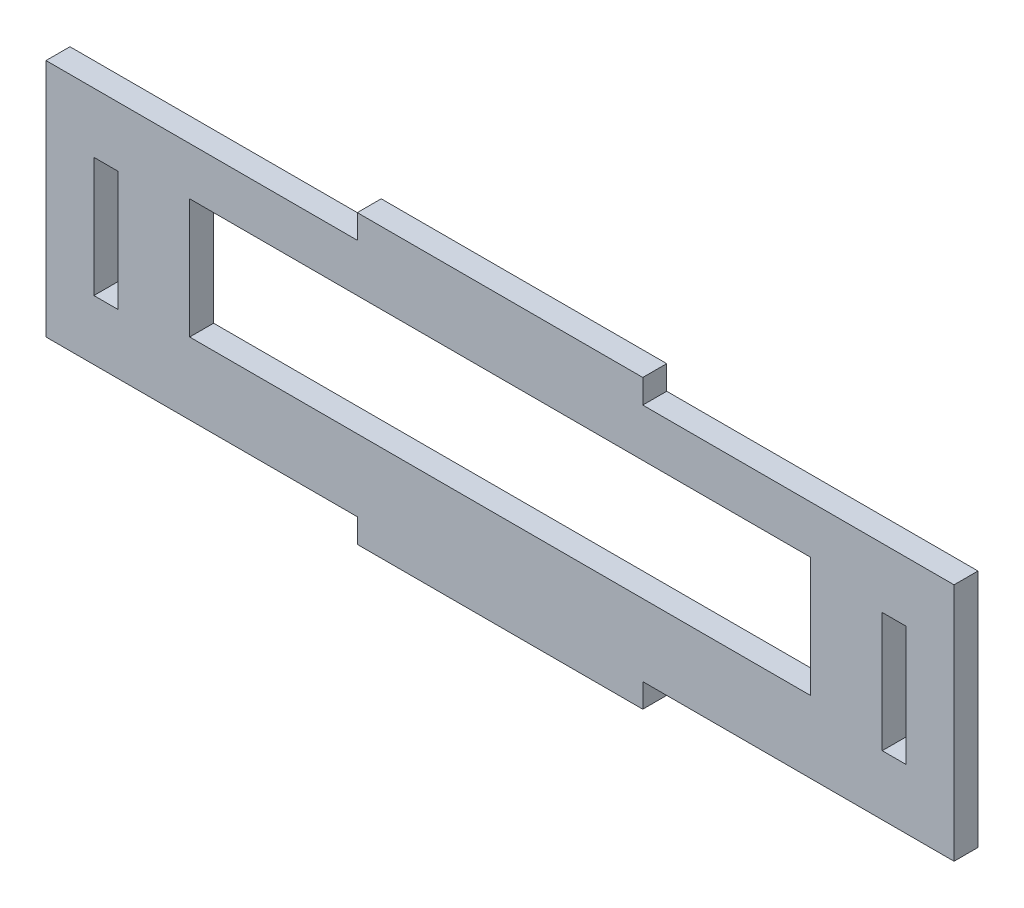
ISO-10303-21;
HEADER;
FILE_DESCRIPTION(('STEP AP214'),'2;1');
FILE_NAME('part.step','',(''),(''),'','','');
FILE_SCHEMA(('AUTOMOTIVE_DESIGN { 1 0 10303 214 1 1 1 1 }'));
ENDSEC;
DATA;
#1=APPLICATION_CONTEXT('core data for automotive mechanical design processes');
#2=APPLICATION_PROTOCOL_DEFINITION('international standard','automotive_design',2000,#1);
#3=PRODUCT_CONTEXT('',#1,'mechanical');
#4=PRODUCT('Part','Part','',(#3));
#5=PRODUCT_RELATED_PRODUCT_CATEGORY('part','',(#4));
#6=PRODUCT_DEFINITION_FORMATION('','',#4);
#7=PRODUCT_DEFINITION_CONTEXT('part definition',#1,'design');
#8=PRODUCT_DEFINITION('design','',#6,#7);
#9=PRODUCT_DEFINITION_SHAPE('','',#8);
#10=(LENGTH_UNIT() NAMED_UNIT(*) SI_UNIT(.MILLI.,.METRE.));
#11=(NAMED_UNIT(*) PLANE_ANGLE_UNIT() SI_UNIT($,.RADIAN.));
#12=(NAMED_UNIT(*) SI_UNIT($,.STERADIAN.) SOLID_ANGLE_UNIT());
#13=UNCERTAINTY_MEASURE_WITH_UNIT(LENGTH_MEASURE(1.E-05),#10,'distance_accuracy_value','');
#14=(GEOMETRIC_REPRESENTATION_CONTEXT(3) GLOBAL_UNCERTAINTY_ASSIGNED_CONTEXT((#13)) GLOBAL_UNIT_ASSIGNED_CONTEXT((#10,
#11,#12)) REPRESENTATION_CONTEXT('',''));
#15=CARTESIAN_POINT('',(0.,0.,0.));
#16=DIRECTION('',(0.,0.,1.));
#17=DIRECTION('',(1.,0.,0.));
#18=AXIS2_PLACEMENT_3D('',#15,#16,#17);
#19=CARTESIAN_POINT('',(0.,0.,2.));
#20=DIRECTION('',(0.,0.,-1.));
#21=DIRECTION('',(-1.,0.,0.));
#22=AXIS2_PLACEMENT_3D('',#19,#20,#21);
#23=PLANE('',#22);
#24=DIRECTION('',(0.,-1.,0.));
#25=VECTOR('',#24,1.);
#26=CARTESIAN_POINT('',(2.,15.,2.));
#27=LINE('',#26,#25);
#28=CARTESIAN_POINT('',(2.,15.,2.));
#29=VERTEX_POINT('',#28);
#30=CARTESIAN_POINT('',(2.,5.,2.));
#31=VERTEX_POINT('',#30);
#32=EDGE_CURVE('E249',#29,#31,#27,.T.);
#33=ORIENTED_EDGE('',*,*,#32,.F.);
#34=DIRECTION('',(-1.,0.,0.));
#35=VECTOR('',#34,1.);
#36=CARTESIAN_POINT('',(2.,15.,2.));
#37=LINE('',#36,#35);
#38=CARTESIAN_POINT('',(3.99999999999999,15.,2.));
#39=VERTEX_POINT('',#38);
#40=EDGE_CURVE('E260',#39,#29,#37,.T.);
#41=ORIENTED_EDGE('',*,*,#40,.F.);
#42=DIRECTION('',(0.,1.,0.));
#43=VECTOR('',#42,1.);
#44=CARTESIAN_POINT('',(3.99999999999999,15.,2.));
#45=LINE('',#44,#43);
#46=CARTESIAN_POINT('',(3.99999999999999,5.,2.));
#47=VERTEX_POINT('',#46);
#48=EDGE_CURVE('E256',#47,#39,#45,.T.);
#49=ORIENTED_EDGE('',*,*,#48,.F.);
#50=DIRECTION('',(1.,0.,0.));
#51=VECTOR('',#50,1.);
#52=CARTESIAN_POINT('',(2.,5.,2.));
#53=LINE('',#52,#51);
#54=EDGE_CURVE('E252',#31,#47,#53,.T.);
#55=ORIENTED_EDGE('',*,*,#54,.F.);
#56=EDGE_LOOP('',(#33,#41,#49,#55));
#57=FACE_BOUND('',#56,.T.);
#58=DIRECTION('',(1.,0.,0.));
#59=VECTOR('',#58,1.);
#60=CARTESIAN_POINT('',(-2.,0.,2.));
#61=LINE('',#60,#59);
#62=CARTESIAN_POINT('',(-2.,0.,2.));
#63=VERTEX_POINT('',#62);
#64=CARTESIAN_POINT('',(24.,0.,2.));
#65=VERTEX_POINT('',#64);
#66=EDGE_CURVE('E335',#63,#65,#61,.T.);
#67=ORIENTED_EDGE('',*,*,#66,.T.);
#68=DIRECTION('',(0.,-1.,0.));
#69=VECTOR('',#68,1.);
#70=CARTESIAN_POINT('',(24.,0.,2.));
#71=LINE('',#70,#69);
#72=CARTESIAN_POINT('',(24.,-2.,2.));
#73=VERTEX_POINT('',#72);
#74=EDGE_CURVE('E338',#65,#73,#71,.T.);
#75=ORIENTED_EDGE('',*,*,#74,.T.);
#76=DIRECTION('',(1.,0.,0.));
#77=VECTOR('',#76,1.);
#78=CARTESIAN_POINT('',(24.,-2.,2.));
#79=LINE('',#78,#77);
#80=CARTESIAN_POINT('',(47.848,-2.,2.));
#81=VERTEX_POINT('',#80);
#82=EDGE_CURVE('E342',#73,#81,#79,.T.);
#83=ORIENTED_EDGE('',*,*,#82,.T.);
#84=DIRECTION('',(0.,1.,0.));
#85=VECTOR('',#84,1.);
#86=CARTESIAN_POINT('',(47.848,-2.,2.));
#87=LINE('',#86,#85);
#88=CARTESIAN_POINT('',(47.848,0.,2.));
#89=VERTEX_POINT('',#88);
#90=EDGE_CURVE('E345',#81,#89,#87,.T.);
#91=ORIENTED_EDGE('',*,*,#90,.T.);
#92=DIRECTION('',(1.,0.,0.));
#93=VECTOR('',#92,1.);
#94=CARTESIAN_POINT('',(47.848,0.,2.));
#95=LINE('',#94,#93);
#96=CARTESIAN_POINT('',(73.848,0.,2.));
#97=VERTEX_POINT('',#96);
#98=EDGE_CURVE('E348',#89,#97,#95,.T.);
#99=ORIENTED_EDGE('',*,*,#98,.T.);
#100=DIRECTION('',(0.,1.,0.));
#101=VECTOR('',#100,1.);
#102=CARTESIAN_POINT('',(73.848,20.,2.));
#103=LINE('',#102,#101);
#104=CARTESIAN_POINT('',(73.848,20.,2.));
#105=VERTEX_POINT('',#104);
#106=EDGE_CURVE('E351',#97,#105,#103,.T.);
#107=ORIENTED_EDGE('',*,*,#106,.T.);
#108=DIRECTION('',(-1.,0.,0.));
#109=VECTOR('',#108,1.);
#110=CARTESIAN_POINT('',(71.848,20.,2.));
#111=LINE('',#110,#109);
#112=CARTESIAN_POINT('',(47.848,20.,2.));
#113=VERTEX_POINT('',#112);
#114=EDGE_CURVE('E354',#105,#113,#111,.T.);
#115=ORIENTED_EDGE('',*,*,#114,.T.);
#116=DIRECTION('',(0.,1.,0.));
#117=VECTOR('',#116,1.);
#118=CARTESIAN_POINT('',(47.848,22.,2.));
#119=LINE('',#118,#117);
#120=CARTESIAN_POINT('',(47.848,22.,2.));
#121=VERTEX_POINT('',#120);
#122=EDGE_CURVE('E357',#113,#121,#119,.T.);
#123=ORIENTED_EDGE('',*,*,#122,.T.);
#124=DIRECTION('',(-1.,0.,0.));
#125=VECTOR('',#124,1.);
#126=CARTESIAN_POINT('',(24.,22.,2.));
#127=LINE('',#126,#125);
#128=CARTESIAN_POINT('',(24.,22.,2.));
#129=VERTEX_POINT('',#128);
#130=EDGE_CURVE('E360',#121,#129,#127,.T.);
#131=ORIENTED_EDGE('',*,*,#130,.T.);
#132=DIRECTION('',(0.,-1.,0.));
#133=VECTOR('',#132,1.);
#134=CARTESIAN_POINT('',(24.,20.,2.));
#135=LINE('',#134,#133);
#136=CARTESIAN_POINT('',(24.,20.,2.));
#137=VERTEX_POINT('',#136);
#138=EDGE_CURVE('E363',#129,#137,#135,.T.);
#139=ORIENTED_EDGE('',*,*,#138,.T.);
#140=DIRECTION('',(-1.,0.,0.));
#141=VECTOR('',#140,1.);
#142=CARTESIAN_POINT('',(0.,20.,2.));
#143=LINE('',#142,#141);
#144=CARTESIAN_POINT('',(-2.,20.,2.));
#145=VERTEX_POINT('',#144);
#146=EDGE_CURVE('E366',#137,#145,#143,.T.);
#147=ORIENTED_EDGE('',*,*,#146,.T.);
#148=DIRECTION('',(0.,-1.,0.));
#149=VECTOR('',#148,1.);
#150=CARTESIAN_POINT('',(-2.,20.,2.));
#151=LINE('',#150,#149);
#152=EDGE_CURVE('E369',#145,#63,#151,.T.);
#153=ORIENTED_EDGE('',*,*,#152,.T.);
#154=EDGE_LOOP('',(#67,#75,#83,#91,#99,#107,#115,#123,#131,#139,#147,#153));
#155=FACE_BOUND('',#154,.T.);
#156=DIRECTION('',(0.,-1.,0.));
#157=VECTOR('',#156,1.);
#158=CARTESIAN_POINT('',(10.,6.,2.));
#159=LINE('',#158,#157);
#160=CARTESIAN_POINT('',(10.,16.,2.));
#161=VERTEX_POINT('',#160);
#162=CARTESIAN_POINT('',(10.,6.,2.));
#163=VERTEX_POINT('',#162);
#164=EDGE_CURVE('E292',#161,#163,#159,.T.);
#165=ORIENTED_EDGE('',*,*,#164,.F.);
#166=DIRECTION('',(-1.,0.,0.));
#167=VECTOR('',#166,1.);
#168=CARTESIAN_POINT('',(10.,16.,2.));
#169=LINE('',#168,#167);
#170=CARTESIAN_POINT('',(61.848,16.,2.));
#171=VERTEX_POINT('',#170);
#172=EDGE_CURVE('E303',#171,#161,#169,.T.);
#173=ORIENTED_EDGE('',*,*,#172,.F.);
#174=DIRECTION('',(0.,1.,0.));
#175=VECTOR('',#174,1.);
#176=CARTESIAN_POINT('',(61.848,6.,2.));
#177=LINE('',#176,#175);
#178=CARTESIAN_POINT('',(61.848,6.,2.));
#179=VERTEX_POINT('',#178);
#180=EDGE_CURVE('E299',#179,#171,#177,.T.);
#181=ORIENTED_EDGE('',*,*,#180,.F.);
#182=DIRECTION('',(1.,0.,0.));
#183=VECTOR('',#182,1.);
#184=CARTESIAN_POINT('',(10.,6.,2.));
#185=LINE('',#184,#183);
#186=EDGE_CURVE('E295',#163,#179,#185,.T.);
#187=ORIENTED_EDGE('',*,*,#186,.F.);
#188=EDGE_LOOP('',(#165,#173,#181,#187));
#189=FACE_BOUND('',#188,.T.);
#190=DIRECTION('',(0.,-1.,0.));
#191=VECTOR('',#190,1.);
#192=CARTESIAN_POINT('',(67.848,15.,2.));
#193=LINE('',#192,#191);
#194=CARTESIAN_POINT('',(67.848,15.,2.));
#195=VERTEX_POINT('',#194);
#196=CARTESIAN_POINT('',(67.848,5.,2.));
#197=VERTEX_POINT('',#196);
#198=EDGE_CURVE('E201',#195,#197,#193,.T.);
#199=ORIENTED_EDGE('',*,*,#198,.F.);
#200=DIRECTION('',(-1.,0.,0.));
#201=VECTOR('',#200,1.);
#202=CARTESIAN_POINT('',(67.848,15.,2.));
#203=LINE('',#202,#201);
#204=CARTESIAN_POINT('',(69.848,15.,2.));
#205=VERTEX_POINT('',#204);
#206=EDGE_CURVE('E227',#205,#195,#203,.T.);
#207=ORIENTED_EDGE('',*,*,#206,.F.);
#208=DIRECTION('',(0.,1.,0.));
#209=VECTOR('',#208,1.);
#210=CARTESIAN_POINT('',(69.848,15.,2.));
#211=LINE('',#210,#209);
#212=CARTESIAN_POINT('',(69.848,5.,2.));
#213=VERTEX_POINT('',#212);
#214=EDGE_CURVE('E223',#213,#205,#211,.T.);
#215=ORIENTED_EDGE('',*,*,#214,.F.);
#216=DIRECTION('',(1.,0.,0.));
#217=VECTOR('',#216,1.);
#218=CARTESIAN_POINT('',(67.848,5.,2.));
#219=LINE('',#218,#217);
#220=EDGE_CURVE('E210',#197,#213,#219,.T.);
#221=ORIENTED_EDGE('',*,*,#220,.F.);
#222=EDGE_LOOP('',(#199,#207,#215,#221));
#223=FACE_BOUND('',#222,.T.);
#224=ADVANCED_FACE('F39',(#57,#155,#189,#223),#23,.F.);
#225=CARTESIAN_POINT('',(0.,0.,0.));
#226=DIRECTION('',(0.,0.,-1.));
#227=DIRECTION('',(-1.,0.,0.));
#228=AXIS2_PLACEMENT_3D('',#225,#226,#227);
#229=PLANE('',#228);
#230=DIRECTION('',(1.,0.,0.));
#231=VECTOR('',#230,1.);
#232=CARTESIAN_POINT('',(0.,0.,0.));
#233=LINE('',#232,#231);
#234=CARTESIAN_POINT('',(-2.,0.,0.));
#235=VERTEX_POINT('',#234);
#236=CARTESIAN_POINT('',(24.,0.,0.));
#237=VERTEX_POINT('',#236);
#238=EDGE_CURVE('E334',#235,#237,#233,.T.);
#239=ORIENTED_EDGE('',*,*,#238,.F.);
#240=DIRECTION('',(0.,-1.,0.));
#241=VECTOR('',#240,1.);
#242=CARTESIAN_POINT('',(-2.,20.,0.));
#243=LINE('',#242,#241);
#244=CARTESIAN_POINT('',(-2.,20.,0.));
#245=VERTEX_POINT('',#244);
#246=EDGE_CURVE('E339',#245,#235,#243,.T.);
#247=ORIENTED_EDGE('',*,*,#246,.F.);
#248=DIRECTION('',(-1.,0.,0.));
#249=VECTOR('',#248,1.);
#250=CARTESIAN_POINT('',(0.,20.,0.));
#251=LINE('',#250,#249);
#252=CARTESIAN_POINT('',(24.,20.,0.));
#253=VERTEX_POINT('',#252);
#254=EDGE_CURVE('E405',#253,#245,#251,.T.);
#255=ORIENTED_EDGE('',*,*,#254,.F.);
#256=DIRECTION('',(0.,-1.,0.));
#257=VECTOR('',#256,1.);
#258=CARTESIAN_POINT('',(24.,20.,0.));
#259=LINE('',#258,#257);
#260=CARTESIAN_POINT('',(24.,22.,0.));
#261=VERTEX_POINT('',#260);
#262=EDGE_CURVE('E401',#261,#253,#259,.T.);
#263=ORIENTED_EDGE('',*,*,#262,.F.);
#264=DIRECTION('',(-1.,0.,0.));
#265=VECTOR('',#264,1.);
#266=CARTESIAN_POINT('',(24.,22.,0.));
#267=LINE('',#266,#265);
#268=CARTESIAN_POINT('',(47.848,22.,0.));
#269=VERTEX_POINT('',#268);
#270=EDGE_CURVE('E398',#269,#261,#267,.T.);
#271=ORIENTED_EDGE('',*,*,#270,.F.);
#272=DIRECTION('',(0.,1.,0.));
#273=VECTOR('',#272,1.);
#274=CARTESIAN_POINT('',(47.848,22.,0.));
#275=LINE('',#274,#273);
#276=CARTESIAN_POINT('',(47.848,20.,0.));
#277=VERTEX_POINT('',#276);
#278=EDGE_CURVE('E395',#277,#269,#275,.T.);
#279=ORIENTED_EDGE('',*,*,#278,.F.);
#280=DIRECTION('',(-1.,0.,0.));
#281=VECTOR('',#280,1.);
#282=CARTESIAN_POINT('',(47.848,20.,0.));
#283=LINE('',#282,#281);
#284=CARTESIAN_POINT('',(73.848,20.,0.));
#285=VERTEX_POINT('',#284);
#286=EDGE_CURVE('E392',#285,#277,#283,.T.);
#287=ORIENTED_EDGE('',*,*,#286,.F.);
#288=DIRECTION('',(0.,1.,0.));
#289=VECTOR('',#288,1.);
#290=CARTESIAN_POINT('',(73.848,20.,0.));
#291=LINE('',#290,#289);
#292=CARTESIAN_POINT('',(73.848,0.,0.));
#293=VERTEX_POINT('',#292);
#294=EDGE_CURVE('E388',#293,#285,#291,.T.);
#295=ORIENTED_EDGE('',*,*,#294,.F.);
#296=DIRECTION('',(1.,0.,0.));
#297=VECTOR('',#296,1.);
#298=CARTESIAN_POINT('',(73.848,0.,0.));
#299=LINE('',#298,#297);
#300=CARTESIAN_POINT('',(47.848,0.,0.));
#301=VERTEX_POINT('',#300);
#302=EDGE_CURVE('E385',#301,#293,#299,.T.);
#303=ORIENTED_EDGE('',*,*,#302,.F.);
#304=DIRECTION('',(0.,1.,0.));
#305=VECTOR('',#304,1.);
#306=CARTESIAN_POINT('',(47.848,-2.,0.));
#307=LINE('',#306,#305);
#308=CARTESIAN_POINT('',(47.848,-2.,0.));
#309=VERTEX_POINT('',#308);
#310=EDGE_CURVE('E381',#309,#301,#307,.T.);
#311=ORIENTED_EDGE('',*,*,#310,.F.);
#312=DIRECTION('',(1.,0.,0.));
#313=VECTOR('',#312,1.);
#314=CARTESIAN_POINT('',(24.,-2.,0.));
#315=LINE('',#314,#313);
#316=CARTESIAN_POINT('',(24.,-2.,0.));
#317=VERTEX_POINT('',#316);
#318=EDGE_CURVE('E378',#317,#309,#315,.T.);
#319=ORIENTED_EDGE('',*,*,#318,.F.);
#320=DIRECTION('',(0.,-1.,0.));
#321=VECTOR('',#320,1.);
#322=CARTESIAN_POINT('',(24.,0.,0.));
#323=LINE('',#322,#321);
#324=EDGE_CURVE('E375',#237,#317,#323,.T.);
#325=ORIENTED_EDGE('',*,*,#324,.F.);
#326=EDGE_LOOP('',(#239,#247,#255,#263,#271,#279,#287,#295,#303,#311,#319,#325));
#327=FACE_BOUND('',#326,.T.);
#328=DIRECTION('',(-1.,0.,0.));
#329=VECTOR('',#328,1.);
#330=CARTESIAN_POINT('',(10.,16.,0.));
#331=LINE('',#330,#329);
#332=CARTESIAN_POINT('',(61.848,16.,0.));
#333=VERTEX_POINT('',#332);
#334=CARTESIAN_POINT('',(10.,16.,0.));
#335=VERTEX_POINT('',#334);
#336=EDGE_CURVE('E296',#333,#335,#331,.T.);
#337=ORIENTED_EDGE('',*,*,#336,.T.);
#338=DIRECTION('',(0.,-1.,0.));
#339=VECTOR('',#338,1.);
#340=CARTESIAN_POINT('',(10.,6.,0.));
#341=LINE('',#340,#339);
#342=CARTESIAN_POINT('',(10.,6.,0.));
#343=VERTEX_POINT('',#342);
#344=EDGE_CURVE('E291',#335,#343,#341,.T.);
#345=ORIENTED_EDGE('',*,*,#344,.T.);
#346=DIRECTION('',(1.,0.,0.));
#347=VECTOR('',#346,1.);
#348=CARTESIAN_POINT('',(10.,6.,0.));
#349=LINE('',#348,#347);
#350=CARTESIAN_POINT('',(61.848,6.,0.));
#351=VERTEX_POINT('',#350);
#352=EDGE_CURVE('E310',#343,#351,#349,.T.);
#353=ORIENTED_EDGE('',*,*,#352,.T.);
#354=DIRECTION('',(0.,1.,0.));
#355=VECTOR('',#354,1.);
#356=CARTESIAN_POINT('',(61.848,6.,0.));
#357=LINE('',#356,#355);
#358=EDGE_CURVE('E314',#351,#333,#357,.T.);
#359=ORIENTED_EDGE('',*,*,#358,.T.);
#360=EDGE_LOOP('',(#337,#345,#353,#359));
#361=FACE_BOUND('',#360,.T.);
#362=DIRECTION('',(-1.,0.,0.));
#363=VECTOR('',#362,1.);
#364=CARTESIAN_POINT('',(2.,15.,0.));
#365=LINE('',#364,#363);
#366=CARTESIAN_POINT('',(3.99999999999999,15.,0.));
#367=VERTEX_POINT('',#366);
#368=CARTESIAN_POINT('',(2.,15.,0.));
#369=VERTEX_POINT('',#368);
#370=EDGE_CURVE('E253',#367,#369,#365,.T.);
#371=ORIENTED_EDGE('',*,*,#370,.T.);
#372=DIRECTION('',(0.,-1.,0.));
#373=VECTOR('',#372,1.);
#374=CARTESIAN_POINT('',(2.,15.,0.));
#375=LINE('',#374,#373);
#376=CARTESIAN_POINT('',(2.,5.,0.));
#377=VERTEX_POINT('',#376);
#378=EDGE_CURVE('E219',#369,#377,#375,.T.);
#379=ORIENTED_EDGE('',*,*,#378,.T.);
#380=DIRECTION('',(1.,0.,0.));
#381=VECTOR('',#380,1.);
#382=CARTESIAN_POINT('',(2.,5.,0.));
#383=LINE('',#382,#381);
#384=CARTESIAN_POINT('',(3.99999999999999,5.,0.));
#385=VERTEX_POINT('',#384);
#386=EDGE_CURVE('E267',#377,#385,#383,.T.);
#387=ORIENTED_EDGE('',*,*,#386,.T.);
#388=DIRECTION('',(0.,1.,0.));
#389=VECTOR('',#388,1.);
#390=CARTESIAN_POINT('',(3.99999999999999,15.,0.));
#391=LINE('',#390,#389);
#392=EDGE_CURVE('E271',#385,#367,#391,.T.);
#393=ORIENTED_EDGE('',*,*,#392,.T.);
#394=EDGE_LOOP('',(#371,#379,#387,#393));
#395=FACE_BOUND('',#394,.T.);
#396=DIRECTION('',(-1.,0.,0.));
#397=VECTOR('',#396,1.);
#398=CARTESIAN_POINT('',(67.848,15.,0.));
#399=LINE('',#398,#397);
#400=CARTESIAN_POINT('',(69.848,15.,0.));
#401=VERTEX_POINT('',#400);
#402=CARTESIAN_POINT('',(67.848,15.,0.));
#403=VERTEX_POINT('',#402);
#404=EDGE_CURVE('E211',#401,#403,#399,.T.);
#405=ORIENTED_EDGE('',*,*,#404,.T.);
#406=DIRECTION('',(0.,-1.,0.));
#407=VECTOR('',#406,1.);
#408=CARTESIAN_POINT('',(67.848,15.,0.));
#409=LINE('',#408,#407);
#410=CARTESIAN_POINT('',(67.848,5.,0.));
#411=VERTEX_POINT('',#410);
#412=EDGE_CURVE('E63',#403,#411,#409,.T.);
#413=ORIENTED_EDGE('',*,*,#412,.T.);
#414=DIRECTION('',(1.,0.,0.));
#415=VECTOR('',#414,1.);
#416=CARTESIAN_POINT('',(67.848,5.,0.));
#417=LINE('',#416,#415);
#418=CARTESIAN_POINT('',(69.848,5.,0.));
#419=VERTEX_POINT('',#418);
#420=EDGE_CURVE('E217',#411,#419,#417,.T.);
#421=ORIENTED_EDGE('',*,*,#420,.T.);
#422=DIRECTION('',(0.,1.,0.));
#423=VECTOR('',#422,1.);
#424=CARTESIAN_POINT('',(69.848,15.,0.));
#425=LINE('',#424,#423);
#426=EDGE_CURVE('E236',#419,#401,#425,.T.);
#427=ORIENTED_EDGE('',*,*,#426,.T.);
#428=EDGE_LOOP('',(#405,#413,#421,#427));
#429=FACE_BOUND('',#428,.T.);
#430=ADVANCED_FACE('F462',(#327,#361,#395,#429),#229,.T.);
#431=CARTESIAN_POINT('',(0.,0.,2.));
#432=DIRECTION('',(0.,1.,0.));
#433=DIRECTION('',(0.,0.,1.));
#434=AXIS2_PLACEMENT_3D('',#431,#432,#433);
#435=PLANE('',#434);
#436=ORIENTED_EDGE('',*,*,#238,.T.);
#437=DIRECTION('',(0.,0.,-1.));
#438=VECTOR('',#437,1.);
#439=CARTESIAN_POINT('',(24.,0.,2.));
#440=LINE('',#439,#438);
#441=EDGE_CURVE('E11',#65,#237,#440,.T.);
#442=ORIENTED_EDGE('',*,*,#441,.F.);
#443=ORIENTED_EDGE('',*,*,#66,.F.);
#444=DIRECTION('',(0.,0.,-1.));
#445=VECTOR('',#444,1.);
#446=CARTESIAN_POINT('',(-2.,0.,2.));
#447=LINE('',#446,#445);
#448=EDGE_CURVE('E372',#63,#235,#447,.T.);
#449=ORIENTED_EDGE('',*,*,#448,.T.);
#450=EDGE_LOOP('',(#436,#442,#443,#449));
#451=FACE_BOUND('',#450,.T.);
#452=ADVANCED_FACE('F41',(#451),#435,.F.);
#453=CARTESIAN_POINT('',(24.,0.,2.));
#454=DIRECTION('',(1.,0.,0.));
#455=DIRECTION('',(0.,0.,-1.));
#456=AXIS2_PLACEMENT_3D('',#453,#454,#455);
#457=PLANE('',#456);
#458=ORIENTED_EDGE('',*,*,#324,.T.);
#459=DIRECTION('',(0.,0.,-1.));
#460=VECTOR('',#459,1.);
#461=CARTESIAN_POINT('',(24.,-2.,2.));
#462=LINE('',#461,#460);
#463=EDGE_CURVE('E48',#73,#317,#462,.T.);
#464=ORIENTED_EDGE('',*,*,#463,.F.);
#465=ORIENTED_EDGE('',*,*,#74,.F.);
#466=ORIENTED_EDGE('',*,*,#441,.T.);
#467=EDGE_LOOP('',(#458,#464,#465,#466));
#468=FACE_BOUND('',#467,.T.);
#469=ADVANCED_FACE('F479',(#468),#457,.F.);
#470=CARTESIAN_POINT('',(24.,-2.,2.));
#471=DIRECTION('',(0.,1.,0.));
#472=DIRECTION('',(0.,0.,1.));
#473=AXIS2_PLACEMENT_3D('',#470,#471,#472);
#474=PLANE('',#473);
#475=ORIENTED_EDGE('',*,*,#318,.T.);
#476=DIRECTION('',(0.,0.,-1.));
#477=VECTOR('',#476,1.);
#478=CARTESIAN_POINT('',(47.848,-2.,2.));
#479=LINE('',#478,#477);
#480=EDGE_CURVE('E446',#81,#309,#479,.T.);
#481=ORIENTED_EDGE('',*,*,#480,.F.);
#482=ORIENTED_EDGE('',*,*,#82,.F.);
#483=ORIENTED_EDGE('',*,*,#463,.T.);
#484=EDGE_LOOP('',(#475,#481,#482,#483));
#485=FACE_BOUND('',#484,.T.);
#486=ADVANCED_FACE('F455',(#485),#474,.F.);
#487=CARTESIAN_POINT('',(47.848,-2.,2.));
#488=DIRECTION('',(-1.,0.,0.));
#489=DIRECTION('',(0.,0.,1.));
#490=AXIS2_PLACEMENT_3D('',#487,#488,#489);
#491=PLANE('',#490);
#492=ORIENTED_EDGE('',*,*,#310,.T.);
#493=DIRECTION('',(0.,0.,-1.));
#494=VECTOR('',#493,1.);
#495=CARTESIAN_POINT('',(47.848,0.,2.));
#496=LINE('',#495,#494);
#497=EDGE_CURVE('E442',#89,#301,#496,.T.);
#498=ORIENTED_EDGE('',*,*,#497,.F.);
#499=ORIENTED_EDGE('',*,*,#90,.F.);
#500=ORIENTED_EDGE('',*,*,#480,.T.);
#501=EDGE_LOOP('',(#492,#498,#499,#500));
#502=FACE_BOUND('',#501,.T.);
#503=ADVANCED_FACE('F467',(#502),#491,.F.);
#504=CARTESIAN_POINT('',(73.848,0.,2.));
#505=DIRECTION('',(0.,1.,0.));
#506=DIRECTION('',(-1.,0.,0.));
#507=AXIS2_PLACEMENT_3D('',#504,#505,#506);
#508=PLANE('',#507);
#509=ORIENTED_EDGE('',*,*,#302,.T.);
#510=DIRECTION('',(0.,0.,-1.));
#511=VECTOR('',#510,1.);
#512=CARTESIAN_POINT('',(73.848,0.,2.));
#513=LINE('',#512,#511);
#514=EDGE_CURVE('E438',#97,#293,#513,.T.);
#515=ORIENTED_EDGE('',*,*,#514,.F.);
#516=ORIENTED_EDGE('',*,*,#98,.F.);
#517=ORIENTED_EDGE('',*,*,#497,.T.);
#518=EDGE_LOOP('',(#509,#515,#516,#517));
#519=FACE_BOUND('',#518,.T.);
#520=ADVANCED_FACE('F471',(#519),#508,.F.);
#521=CARTESIAN_POINT('',(73.848,20.,2.));
#522=DIRECTION('',(-1.,0.,0.));
#523=DIRECTION('',(0.,0.,1.));
#524=AXIS2_PLACEMENT_3D('',#521,#522,#523);
#525=PLANE('',#524);
#526=ORIENTED_EDGE('',*,*,#294,.T.);
#527=DIRECTION('',(0.,0.,-1.));
#528=VECTOR('',#527,1.);
#529=CARTESIAN_POINT('',(73.848,20.,2.));
#530=LINE('',#529,#528);
#531=EDGE_CURVE('E434',#105,#285,#530,.T.);
#532=ORIENTED_EDGE('',*,*,#531,.F.);
#533=ORIENTED_EDGE('',*,*,#106,.F.);
#534=ORIENTED_EDGE('',*,*,#514,.T.);
#535=EDGE_LOOP('',(#526,#532,#533,#534));
#536=FACE_BOUND('',#535,.T.);
#537=ADVANCED_FACE('F510',(#536),#525,.F.);
#538=CARTESIAN_POINT('',(47.848,20.,2.));
#539=DIRECTION('',(0.,-1.,0.));
#540=DIRECTION('',(0.,0.,-1.));
#541=AXIS2_PLACEMENT_3D('',#538,#539,#540);
#542=PLANE('',#541);
#543=ORIENTED_EDGE('',*,*,#286,.T.);
#544=DIRECTION('',(0.,0.,-1.));
#545=VECTOR('',#544,1.);
#546=CARTESIAN_POINT('',(47.848,20.,2.));
#547=LINE('',#546,#545);
#548=EDGE_CURVE('E430',#113,#277,#547,.T.);
#549=ORIENTED_EDGE('',*,*,#548,.F.);
#550=ORIENTED_EDGE('',*,*,#114,.F.);
#551=ORIENTED_EDGE('',*,*,#531,.T.);
#552=EDGE_LOOP('',(#543,#549,#550,#551));
#553=FACE_BOUND('',#552,.T.);
#554=ADVANCED_FACE('F508',(#553),#542,.F.);
#555=CARTESIAN_POINT('',(47.848,22.,2.));
#556=DIRECTION('',(-1.,0.,0.));
#557=DIRECTION('',(0.,0.,1.));
#558=AXIS2_PLACEMENT_3D('',#555,#556,#557);
#559=PLANE('',#558);
#560=ORIENTED_EDGE('',*,*,#278,.T.);
#561=DIRECTION('',(0.,0.,-1.));
#562=VECTOR('',#561,1.);
#563=CARTESIAN_POINT('',(47.848,22.,2.));
#564=LINE('',#563,#562);
#565=EDGE_CURVE('E426',#121,#269,#564,.T.);
#566=ORIENTED_EDGE('',*,*,#565,.F.);
#567=ORIENTED_EDGE('',*,*,#122,.F.);
#568=ORIENTED_EDGE('',*,*,#548,.T.);
#569=EDGE_LOOP('',(#560,#566,#567,#568));
#570=FACE_BOUND('',#569,.T.);
#571=ADVANCED_FACE('F503',(#570),#559,.F.);
#572=CARTESIAN_POINT('',(24.,22.,2.));
#573=DIRECTION('',(0.,-1.,0.));
#574=DIRECTION('',(0.,0.,-1.));
#575=AXIS2_PLACEMENT_3D('',#572,#573,#574);
#576=PLANE('',#575);
#577=ORIENTED_EDGE('',*,*,#270,.T.);
#578=DIRECTION('',(0.,0.,-1.));
#579=VECTOR('',#578,1.);
#580=CARTESIAN_POINT('',(24.,22.,2.));
#581=LINE('',#580,#579);
#582=EDGE_CURVE('E422',#129,#261,#581,.T.);
#583=ORIENTED_EDGE('',*,*,#582,.F.);
#584=ORIENTED_EDGE('',*,*,#130,.F.);
#585=ORIENTED_EDGE('',*,*,#565,.T.);
#586=EDGE_LOOP('',(#577,#583,#584,#585));
#587=FACE_BOUND('',#586,.T.);
#588=ADVANCED_FACE('F499',(#587),#576,.F.);
#589=CARTESIAN_POINT('',(24.,20.,2.));
#590=DIRECTION('',(1.,0.,0.));
#591=DIRECTION('',(0.,0.,-1.));
#592=AXIS2_PLACEMENT_3D('',#589,#590,#591);
#593=PLANE('',#592);
#594=ORIENTED_EDGE('',*,*,#262,.T.);
#595=DIRECTION('',(0.,0.,-1.));
#596=VECTOR('',#595,1.);
#597=CARTESIAN_POINT('',(24.,20.,2.));
#598=LINE('',#597,#596);
#599=EDGE_CURVE('E418',#137,#253,#598,.T.);
#600=ORIENTED_EDGE('',*,*,#599,.F.);
#601=ORIENTED_EDGE('',*,*,#138,.F.);
#602=ORIENTED_EDGE('',*,*,#582,.T.);
#603=EDGE_LOOP('',(#594,#600,#601,#602));
#604=FACE_BOUND('',#603,.T.);
#605=ADVANCED_FACE('F494',(#604),#593,.F.);
#606=CARTESIAN_POINT('',(0.,20.,2.));
#607=DIRECTION('',(0.,-1.,0.));
#608=DIRECTION('',(0.,0.,-1.));
#609=AXIS2_PLACEMENT_3D('',#606,#607,#608);
#610=PLANE('',#609);
#611=ORIENTED_EDGE('',*,*,#254,.T.);
#612=DIRECTION('',(0.,0.,-1.));
#613=VECTOR('',#612,1.);
#614=CARTESIAN_POINT('',(-2.,20.,2.));
#615=LINE('',#614,#613);
#616=EDGE_CURVE('E414',#145,#245,#615,.T.);
#617=ORIENTED_EDGE('',*,*,#616,.F.);
#618=ORIENTED_EDGE('',*,*,#146,.F.);
#619=ORIENTED_EDGE('',*,*,#599,.T.);
#620=EDGE_LOOP('',(#611,#617,#618,#619));
#621=FACE_BOUND('',#620,.T.);
#622=ADVANCED_FACE('F489',(#621),#610,.F.);
#623=CARTESIAN_POINT('',(-2.,20.,2.));
#624=DIRECTION('',(1.,0.,0.));
#625=DIRECTION('',(0.,1.,0.));
#626=AXIS2_PLACEMENT_3D('',#623,#624,#625);
#627=PLANE('',#626);
#628=ORIENTED_EDGE('',*,*,#246,.T.);
#629=ORIENTED_EDGE('',*,*,#448,.F.);
#630=ORIENTED_EDGE('',*,*,#152,.F.);
#631=ORIENTED_EDGE('',*,*,#616,.T.);
#632=EDGE_LOOP('',(#628,#629,#630,#631));
#633=FACE_BOUND('',#632,.T.);
#634=ADVANCED_FACE('F484',(#633),#627,.F.);
#635=CARTESIAN_POINT('',(10.,6.,2.));
#636=DIRECTION('',(1.,0.,0.));
#637=DIRECTION('',(0.,0.,-1.));
#638=AXIS2_PLACEMENT_3D('',#635,#636,#637);
#639=PLANE('',#638);
#640=ORIENTED_EDGE('',*,*,#344,.F.);
#641=DIRECTION('',(0.,0.,-1.));
#642=VECTOR('',#641,1.);
#643=CARTESIAN_POINT('',(10.,16.,2.));
#644=LINE('',#643,#642);
#645=EDGE_CURVE('E306',#161,#335,#644,.T.);
#646=ORIENTED_EDGE('',*,*,#645,.F.);
#647=ORIENTED_EDGE('',*,*,#164,.T.);
#648=DIRECTION('',(0.,0.,-1.));
#649=VECTOR('',#648,1.);
#650=CARTESIAN_POINT('',(10.,6.,2.));
#651=LINE('',#650,#649);
#652=EDGE_CURVE('E330',#163,#343,#651,.T.);
#653=ORIENTED_EDGE('',*,*,#652,.T.);
#654=EDGE_LOOP('',(#640,#646,#647,#653));
#655=FACE_BOUND('',#654,.T.);
#656=ADVANCED_FACE('F528',(#655),#639,.T.);
#657=CARTESIAN_POINT('',(10.,6.,2.));
#658=DIRECTION('',(0.,1.,0.));
#659=DIRECTION('',(0.,0.,1.));
#660=AXIS2_PLACEMENT_3D('',#657,#658,#659);
#661=PLANE('',#660);
#662=ORIENTED_EDGE('',*,*,#352,.F.);
#663=ORIENTED_EDGE('',*,*,#652,.F.);
#664=ORIENTED_EDGE('',*,*,#186,.T.);
#665=DIRECTION('',(0.,0.,-1.));
#666=VECTOR('',#665,1.);
#667=CARTESIAN_POINT('',(61.848,6.,2.));
#668=LINE('',#667,#666);
#669=EDGE_CURVE('E327',#179,#351,#668,.T.);
#670=ORIENTED_EDGE('',*,*,#669,.T.);
#671=EDGE_LOOP('',(#662,#663,#664,#670));
#672=FACE_BOUND('',#671,.T.);
#673=ADVANCED_FACE('F566',(#672),#661,.T.);
#674=CARTESIAN_POINT('',(61.848,6.,2.));
#675=DIRECTION('',(-1.,0.,0.));
#676=DIRECTION('',(0.,0.,1.));
#677=AXIS2_PLACEMENT_3D('',#674,#675,#676);
#678=PLANE('',#677);
#679=ORIENTED_EDGE('',*,*,#358,.F.);
#680=ORIENTED_EDGE('',*,*,#669,.F.);
#681=ORIENTED_EDGE('',*,*,#180,.T.);
#682=DIRECTION('',(0.,0.,-1.));
#683=VECTOR('',#682,1.);
#684=CARTESIAN_POINT('',(61.848,16.,2.));
#685=LINE('',#684,#683);
#686=EDGE_CURVE('E324',#171,#333,#685,.T.);
#687=ORIENTED_EDGE('',*,*,#686,.T.);
#688=EDGE_LOOP('',(#679,#680,#681,#687));
#689=FACE_BOUND('',#688,.T.);
#690=ADVANCED_FACE('F573',(#689),#678,.T.);
#691=CARTESIAN_POINT('',(10.,16.,2.));
#692=DIRECTION('',(0.,-1.,0.));
#693=DIRECTION('',(0.,0.,-1.));
#694=AXIS2_PLACEMENT_3D('',#691,#692,#693);
#695=PLANE('',#694);
#696=ORIENTED_EDGE('',*,*,#336,.F.);
#697=ORIENTED_EDGE('',*,*,#686,.F.);
#698=ORIENTED_EDGE('',*,*,#172,.T.);
#699=ORIENTED_EDGE('',*,*,#645,.T.);
#700=EDGE_LOOP('',(#696,#697,#698,#699));
#701=FACE_BOUND('',#700,.T.);
#702=ADVANCED_FACE('F580',(#701),#695,.T.);
#703=CARTESIAN_POINT('',(2.,15.,2.));
#704=DIRECTION('',(1.,0.,0.));
#705=DIRECTION('',(0.,1.,0.));
#706=AXIS2_PLACEMENT_3D('',#703,#704,#705);
#707=PLANE('',#706);
#708=ORIENTED_EDGE('',*,*,#378,.F.);
#709=DIRECTION('',(0.,0.,-1.));
#710=VECTOR('',#709,1.);
#711=CARTESIAN_POINT('',(2.,15.,2.));
#712=LINE('',#711,#710);
#713=EDGE_CURVE('E263',#29,#369,#712,.T.);
#714=ORIENTED_EDGE('',*,*,#713,.F.);
#715=ORIENTED_EDGE('',*,*,#32,.T.);
#716=DIRECTION('',(0.,0.,-1.));
#717=VECTOR('',#716,1.);
#718=CARTESIAN_POINT('',(2.,5.,2.));
#719=LINE('',#718,#717);
#720=EDGE_CURVE('E287',#31,#377,#719,.T.);
#721=ORIENTED_EDGE('',*,*,#720,.T.);
#722=EDGE_LOOP('',(#708,#714,#715,#721));
#723=FACE_BOUND('',#722,.T.);
#724=ADVANCED_FACE('F588',(#723),#707,.T.);
#725=CARTESIAN_POINT('',(2.,5.,2.));
#726=DIRECTION('',(0.,1.,0.));
#727=DIRECTION('',(0.,0.,1.));
#728=AXIS2_PLACEMENT_3D('',#725,#726,#727);
#729=PLANE('',#728);
#730=ORIENTED_EDGE('',*,*,#386,.F.);
#731=ORIENTED_EDGE('',*,*,#720,.F.);
#732=ORIENTED_EDGE('',*,*,#54,.T.);
#733=DIRECTION('',(0.,0.,-1.));
#734=VECTOR('',#733,1.);
#735=CARTESIAN_POINT('',(3.99999999999999,5.,2.));
#736=LINE('',#735,#734);
#737=EDGE_CURVE('E284',#47,#385,#736,.T.);
#738=ORIENTED_EDGE('',*,*,#737,.T.);
#739=EDGE_LOOP('',(#730,#731,#732,#738));
#740=FACE_BOUND('',#739,.T.);
#741=ADVANCED_FACE('F596',(#740),#729,.T.);
#742=CARTESIAN_POINT('',(3.99999999999999,15.,2.));
#743=DIRECTION('',(-1.,0.,0.));
#744=DIRECTION('',(0.,0.,1.));
#745=AXIS2_PLACEMENT_3D('',#742,#743,#744);
#746=PLANE('',#745);
#747=ORIENTED_EDGE('',*,*,#392,.F.);
#748=ORIENTED_EDGE('',*,*,#737,.F.);
#749=ORIENTED_EDGE('',*,*,#48,.T.);
#750=DIRECTION('',(0.,0.,-1.));
#751=VECTOR('',#750,1.);
#752=CARTESIAN_POINT('',(3.99999999999999,15.,2.));
#753=LINE('',#752,#751);
#754=EDGE_CURVE('E281',#39,#367,#753,.T.);
#755=ORIENTED_EDGE('',*,*,#754,.T.);
#756=EDGE_LOOP('',(#747,#748,#749,#755));
#757=FACE_BOUND('',#756,.T.);
#758=ADVANCED_FACE('F604',(#757),#746,.T.);
#759=CARTESIAN_POINT('',(2.,15.,2.));
#760=DIRECTION('',(0.,-1.,0.));
#761=DIRECTION('',(0.,0.,-1.));
#762=AXIS2_PLACEMENT_3D('',#759,#760,#761);
#763=PLANE('',#762);
#764=ORIENTED_EDGE('',*,*,#370,.F.);
#765=ORIENTED_EDGE('',*,*,#754,.F.);
#766=ORIENTED_EDGE('',*,*,#40,.T.);
#767=ORIENTED_EDGE('',*,*,#713,.T.);
#768=EDGE_LOOP('',(#764,#765,#766,#767));
#769=FACE_BOUND('',#768,.T.);
#770=ADVANCED_FACE('F612',(#769),#763,.T.);
#771=CARTESIAN_POINT('',(67.848,15.,2.));
#772=DIRECTION('',(1.,0.,0.));
#773=DIRECTION('',(0.,0.,-1.));
#774=AXIS2_PLACEMENT_3D('',#771,#772,#773);
#775=PLANE('',#774);
#776=ORIENTED_EDGE('',*,*,#412,.F.);
#777=DIRECTION('',(0.,0.,-1.));
#778=VECTOR('',#777,1.);
#779=CARTESIAN_POINT('',(67.848,15.,2.));
#780=LINE('',#779,#778);
#781=EDGE_CURVE('E205',#195,#403,#780,.T.);
#782=ORIENTED_EDGE('',*,*,#781,.F.);
#783=ORIENTED_EDGE('',*,*,#198,.T.);
#784=DIRECTION('',(0.,0.,-1.));
#785=VECTOR('',#784,1.);
#786=CARTESIAN_POINT('',(67.848,5.,2.));
#787=LINE('',#786,#785);
#788=EDGE_CURVE('E204',#197,#411,#787,.T.);
#789=ORIENTED_EDGE('',*,*,#788,.T.);
#790=EDGE_LOOP('',(#776,#782,#783,#789));
#791=FACE_BOUND('',#790,.T.);
#792=ADVANCED_FACE('F203',(#791),#775,.T.);
#793=CARTESIAN_POINT('',(67.848,5.,2.));
#794=DIRECTION('',(0.,1.,0.));
#795=DIRECTION('',(0.,0.,1.));
#796=AXIS2_PLACEMENT_3D('',#793,#794,#795);
#797=PLANE('',#796);
#798=ORIENTED_EDGE('',*,*,#420,.F.);
#799=ORIENTED_EDGE('',*,*,#788,.F.);
#800=ORIENTED_EDGE('',*,*,#220,.T.);
#801=DIRECTION('',(0.,0.,-1.));
#802=VECTOR('',#801,1.);
#803=CARTESIAN_POINT('',(69.848,5.,2.));
#804=LINE('',#803,#802);
#805=EDGE_CURVE('E220',#213,#419,#804,.T.);
#806=ORIENTED_EDGE('',*,*,#805,.T.);
#807=EDGE_LOOP('',(#798,#799,#800,#806));
#808=FACE_BOUND('',#807,.T.);
#809=ADVANCED_FACE('F214',(#808),#797,.T.);
#810=CARTESIAN_POINT('',(69.848,15.,2.));
#811=DIRECTION('',(-1.,0.,0.));
#812=DIRECTION('',(0.,0.,1.));
#813=AXIS2_PLACEMENT_3D('',#810,#811,#812);
#814=PLANE('',#813);
#815=ORIENTED_EDGE('',*,*,#426,.F.);
#816=ORIENTED_EDGE('',*,*,#805,.F.);
#817=ORIENTED_EDGE('',*,*,#214,.T.);
#818=DIRECTION('',(0.,0.,-1.));
#819=VECTOR('',#818,1.);
#820=CARTESIAN_POINT('',(69.848,15.,2.));
#821=LINE('',#820,#819);
#822=EDGE_CURVE('E55',#205,#401,#821,.T.);
#823=ORIENTED_EDGE('',*,*,#822,.T.);
#824=EDGE_LOOP('',(#815,#816,#817,#823));
#825=FACE_BOUND('',#824,.T.);
#826=ADVANCED_FACE('F633',(#825),#814,.T.);
#827=CARTESIAN_POINT('',(67.848,15.,2.));
#828=DIRECTION('',(0.,-1.,0.));
#829=DIRECTION('',(0.,0.,-1.));
#830=AXIS2_PLACEMENT_3D('',#827,#828,#829);
#831=PLANE('',#830);
#832=ORIENTED_EDGE('',*,*,#404,.F.);
#833=ORIENTED_EDGE('',*,*,#822,.F.);
#834=ORIENTED_EDGE('',*,*,#206,.T.);
#835=ORIENTED_EDGE('',*,*,#781,.T.);
#836=EDGE_LOOP('',(#832,#833,#834,#835));
#837=FACE_BOUND('',#836,.T.);
#838=ADVANCED_FACE('F640',(#837),#831,.T.);
#839=CLOSED_SHELL('',(#224,#430,#452,#469,#486,#503,#520,#537,#554,#571,#588,#605,#622,#634,
#656,#673,#690,#702,#724,#741,#758,#770,#792,#809,#826,#838));
#840=MANIFOLD_SOLID_BREP('B2',#839);
#841=ADVANCED_BREP_SHAPE_REPRESENTATION('',(#18,#840),#14);
#842=SHAPE_DEFINITION_REPRESENTATION(#9,#841);
ENDSEC;
END-ISO-10303-21;
